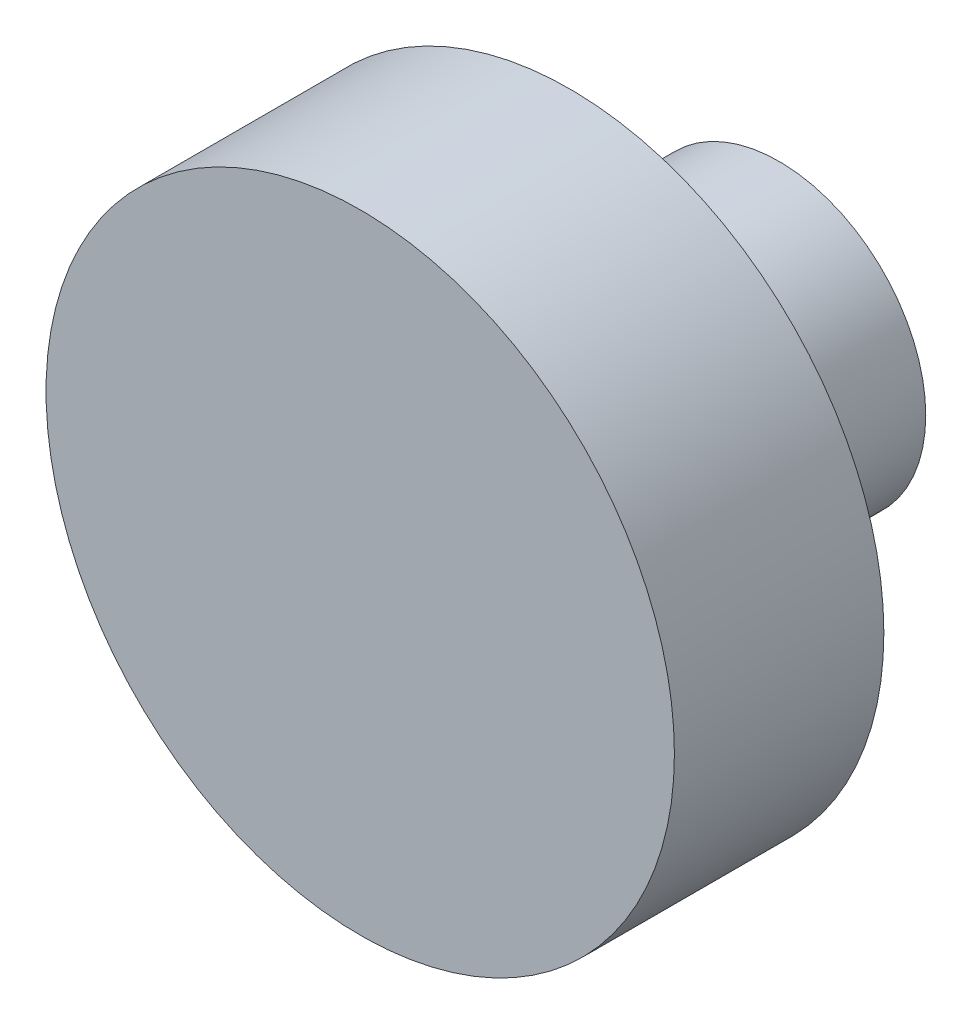
ISO-10303-21;
HEADER;
FILE_DESCRIPTION(('STEP AP214'),'2;1');
FILE_NAME('part.step','',(''),(''),'','','');
FILE_SCHEMA(('AUTOMOTIVE_DESIGN { 1 0 10303 214 1 1 1 1 }'));
ENDSEC;
DATA;
#1=APPLICATION_CONTEXT('core data for automotive mechanical design processes');
#2=APPLICATION_PROTOCOL_DEFINITION('international standard','automotive_design',2000,#1);
#3=PRODUCT_CONTEXT('',#1,'mechanical');
#4=PRODUCT('Part','Part','',(#3));
#5=PRODUCT_RELATED_PRODUCT_CATEGORY('part','',(#4));
#6=PRODUCT_DEFINITION_FORMATION('','',#4);
#7=PRODUCT_DEFINITION_CONTEXT('part definition',#1,'design');
#8=PRODUCT_DEFINITION('design','',#6,#7);
#9=PRODUCT_DEFINITION_SHAPE('','',#8);
#10=(LENGTH_UNIT() NAMED_UNIT(*) SI_UNIT(.MILLI.,.METRE.));
#11=(NAMED_UNIT(*) PLANE_ANGLE_UNIT() SI_UNIT($,.RADIAN.));
#12=(NAMED_UNIT(*) SI_UNIT($,.STERADIAN.) SOLID_ANGLE_UNIT());
#13=UNCERTAINTY_MEASURE_WITH_UNIT(LENGTH_MEASURE(1.E-05),#10,'distance_accuracy_value','');
#14=(GEOMETRIC_REPRESENTATION_CONTEXT(3) GLOBAL_UNCERTAINTY_ASSIGNED_CONTEXT((#13)) GLOBAL_UNIT_ASSIGNED_CONTEXT((#10,
#11,#12)) REPRESENTATION_CONTEXT('',''));
#15=CARTESIAN_POINT('',(0.,0.,0.));
#16=DIRECTION('',(0.,0.,1.));
#17=DIRECTION('',(1.,0.,0.));
#18=AXIS2_PLACEMENT_3D('',#15,#16,#17);
#19=CARTESIAN_POINT('',(0.,0.,2.));
#20=DIRECTION('',(0.,0.,-1.));
#21=DIRECTION('',(-1.,0.,0.));
#22=AXIS2_PLACEMENT_3D('',#19,#20,#21);
#23=CYLINDRICAL_SURFACE('',#22,1.4);
#24=CARTESIAN_POINT('',(0.,0.,2.));
#25=DIRECTION('',(0.,0.,1.));
#26=DIRECTION('',(1.,0.,0.));
#27=AXIS2_PLACEMENT_3D('',#24,#25,#26);
#28=CIRCLE('',#27,1.4);
#29=CARTESIAN_POINT('',(1.4,0.,2.));
#30=VERTEX_POINT('',#29);
#31=EDGE_CURVE('E10',#30,#30,#28,.T.);
#32=ORIENTED_EDGE('',*,*,#31,.F.);
#33=EDGE_LOOP('',(#32));
#34=FACE_BOUND('',#33,.T.);
#35=CARTESIAN_POINT('',(0.,0.,0.));
#36=DIRECTION('',(0.,0.,1.));
#37=DIRECTION('',(1.,0.,0.));
#38=AXIS2_PLACEMENT_3D('',#35,#36,#37);
#39=CIRCLE('',#38,1.4);
#40=CARTESIAN_POINT('',(1.4,0.,0.));
#41=VERTEX_POINT('',#40);
#42=EDGE_CURVE('E38',#41,#41,#39,.T.);
#43=ORIENTED_EDGE('',*,*,#42,.T.);
#44=EDGE_LOOP('',(#43));
#45=FACE_BOUND('',#44,.T.);
#46=ADVANCED_FACE('F35',(#34,#45),#23,.T.);
#47=CARTESIAN_POINT('',(0.,0.,0.));
#48=DIRECTION('',(0.,0.,1.));
#49=DIRECTION('',(1.,0.,0.));
#50=AXIS2_PLACEMENT_3D('',#47,#48,#49);
#51=PLANE('',#50);
#52=ORIENTED_EDGE('',*,*,#42,.F.);
#53=EDGE_LOOP('',(#52));
#54=FACE_BOUND('',#53,.T.);
#55=ADVANCED_FACE('F63',(#54),#51,.F.);
#56=CARTESIAN_POINT('',(0.,0.,2.));
#57=DIRECTION('',(0.,0.,1.));
#58=DIRECTION('',(1.,0.,0.));
#59=AXIS2_PLACEMENT_3D('',#56,#57,#58);
#60=PLANE('',#59);
#61=CARTESIAN_POINT('',(0.,0.,2.));
#62=DIRECTION('',(0.,0.,1.));
#63=DIRECTION('',(1.,0.,0.));
#64=AXIS2_PLACEMENT_3D('',#61,#62,#63);
#65=CIRCLE('',#64,3.);
#66=CARTESIAN_POINT('',(3.,0.,2.));
#67=VERTEX_POINT('',#66);
#68=EDGE_CURVE('E47',#67,#67,#65,.T.);
#69=ORIENTED_EDGE('',*,*,#68,.F.);
#70=EDGE_LOOP('',(#69));
#71=FACE_BOUND('',#70,.T.);
#72=ORIENTED_EDGE('',*,*,#31,.T.);
#73=EDGE_LOOP('',(#72));
#74=FACE_BOUND('',#73,.T.);
#75=ADVANCED_FACE('F58',(#71,#74),#60,.F.);
#76=CARTESIAN_POINT('',(0.,0.,4.));
#77=DIRECTION('',(0.,0.,-1.));
#78=DIRECTION('',(-1.,0.,0.));
#79=AXIS2_PLACEMENT_3D('',#76,#77,#78);
#80=CYLINDRICAL_SURFACE('',#79,3.);
#81=CARTESIAN_POINT('',(0.,0.,4.));
#82=DIRECTION('',(0.,0.,1.));
#83=DIRECTION('',(1.,0.,0.));
#84=AXIS2_PLACEMENT_3D('',#81,#82,#83);
#85=CIRCLE('',#84,3.);
#86=CARTESIAN_POINT('',(3.,0.,4.));
#87=VERTEX_POINT('',#86);
#88=EDGE_CURVE('E45',#87,#87,#85,.T.);
#89=ORIENTED_EDGE('',*,*,#88,.F.);
#90=EDGE_LOOP('',(#89));
#91=FACE_BOUND('',#90,.T.);
#92=ORIENTED_EDGE('',*,*,#68,.T.);
#93=EDGE_LOOP('',(#92));
#94=FACE_BOUND('',#93,.T.);
#95=ADVANCED_FACE('F55',(#91,#94),#80,.T.);
#96=CARTESIAN_POINT('',(0.,0.,4.));
#97=DIRECTION('',(0.,0.,1.));
#98=DIRECTION('',(1.,0.,0.));
#99=AXIS2_PLACEMENT_3D('',#96,#97,#98);
#100=PLANE('',#99);
#101=ORIENTED_EDGE('',*,*,#88,.T.);
#102=EDGE_LOOP('',(#101));
#103=FACE_BOUND('',#102,.T.);
#104=ADVANCED_FACE('F53',(#103),#100,.T.);
#105=CLOSED_SHELL('',(#46,#55,#75,#95,#104));
#106=MANIFOLD_SOLID_BREP('B2',#105);
#107=ADVANCED_BREP_SHAPE_REPRESENTATION('',(#18,#106),#14);
#108=SHAPE_DEFINITION_REPRESENTATION(#9,#107);
ENDSEC;
END-ISO-10303-21;
